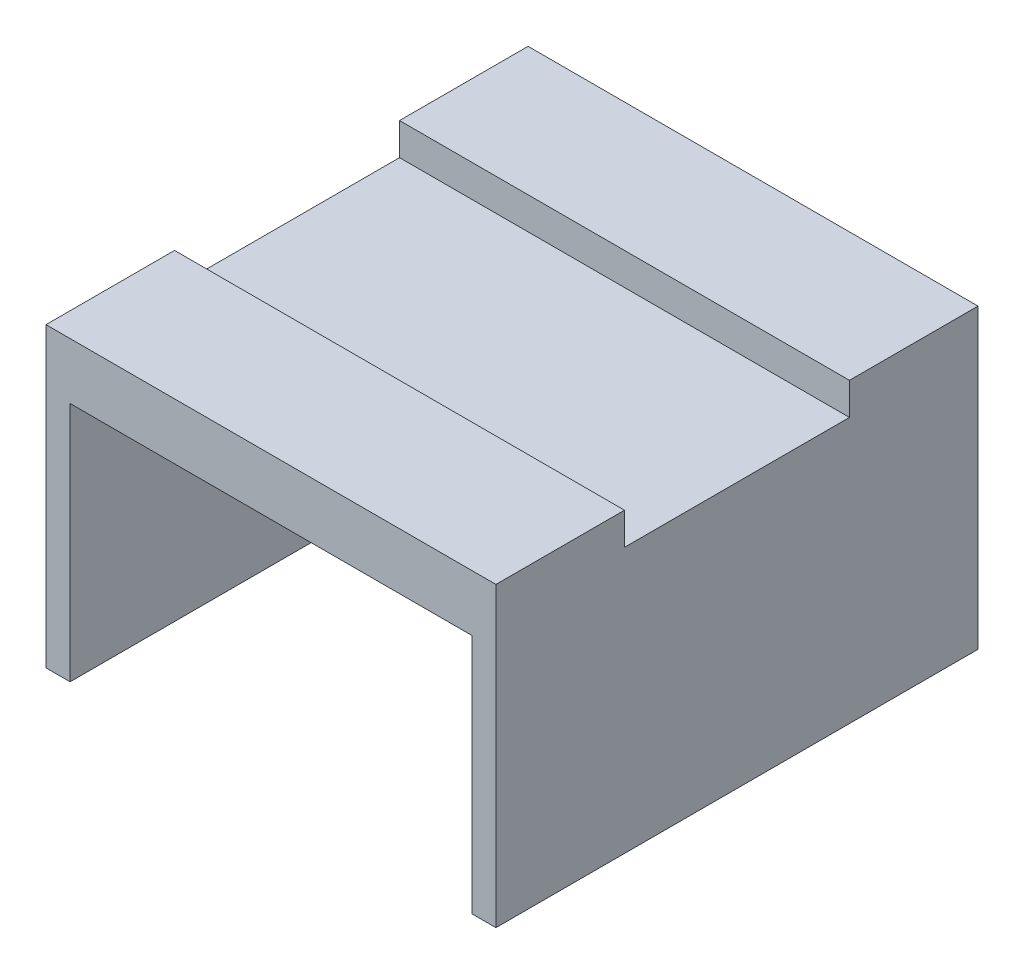
ISO-10303-21;
HEADER;
FILE_DESCRIPTION(('STEP AP214'),'2;1');
FILE_NAME('part.step','',(''),(''),'','','');
FILE_SCHEMA(('AUTOMOTIVE_DESIGN { 1 0 10303 214 1 1 1 1 }'));
ENDSEC;
DATA;
#1=APPLICATION_CONTEXT('core data for automotive mechanical design processes');
#2=APPLICATION_PROTOCOL_DEFINITION('international standard','automotive_design',2000,#1);
#3=PRODUCT_CONTEXT('',#1,'mechanical');
#4=PRODUCT('Part','Part','',(#3));
#5=PRODUCT_RELATED_PRODUCT_CATEGORY('part','',(#4));
#6=PRODUCT_DEFINITION_FORMATION('','',#4);
#7=PRODUCT_DEFINITION_CONTEXT('part definition',#1,'design');
#8=PRODUCT_DEFINITION('design','',#6,#7);
#9=PRODUCT_DEFINITION_SHAPE('','',#8);
#10=(LENGTH_UNIT() NAMED_UNIT(*) SI_UNIT(.MILLI.,.METRE.));
#11=(NAMED_UNIT(*) PLANE_ANGLE_UNIT() SI_UNIT($,.RADIAN.));
#12=(NAMED_UNIT(*) SI_UNIT($,.STERADIAN.) SOLID_ANGLE_UNIT());
#13=UNCERTAINTY_MEASURE_WITH_UNIT(LENGTH_MEASURE(1.E-05),#10,'distance_accuracy_value','');
#14=(GEOMETRIC_REPRESENTATION_CONTEXT(3) GLOBAL_UNCERTAINTY_ASSIGNED_CONTEXT((#13)) GLOBAL_UNIT_ASSIGNED_CONTEXT((#10,
#11,#12)) REPRESENTATION_CONTEXT('',''));
#15=CARTESIAN_POINT('',(0.,0.,0.));
#16=DIRECTION('',(0.,0.,1.));
#17=DIRECTION('',(1.,0.,0.));
#18=AXIS2_PLACEMENT_3D('',#15,#16,#17);
#19=CARTESIAN_POINT('',(0.,16.5,0.));
#20=DIRECTION('',(0.,1.,0.));
#21=DIRECTION('',(0.,0.,1.));
#22=AXIS2_PLACEMENT_3D('',#19,#20,#21);
#23=PLANE('',#22);
#24=DIRECTION('',(0.,0.,1.));
#25=VECTOR('',#24,1.);
#26=CARTESIAN_POINT('',(-12.9747634069401,16.5,-7.61041009463722));
#27=LINE('',#26,#25);
#28=CARTESIAN_POINT('',(-12.9747634069401,16.5,0.38958990536278));
#29=VERTEX_POINT('',#28);
#30=CARTESIAN_POINT('',(-12.9747634069401,16.5,14.3895899053628));
#31=VERTEX_POINT('',#30);
#32=EDGE_CURVE('E224',#29,#31,#27,.T.);
#33=ORIENTED_EDGE('',*,*,#32,.T.);
#34=DIRECTION('',(-1.,0.,0.));
#35=VECTOR('',#34,1.);
#36=CARTESIAN_POINT('',(-12.9747634069401,16.5,14.3895899053628));
#37=LINE('',#36,#35);
#38=CARTESIAN_POINT('',(15.0252365930599,16.5,14.3895899053628));
#39=VERTEX_POINT('',#38);
#40=EDGE_CURVE('E161',#39,#31,#37,.T.);
#41=ORIENTED_EDGE('',*,*,#40,.F.);
#42=DIRECTION('',(0.,0.,-1.));
#43=VECTOR('',#42,1.);
#44=CARTESIAN_POINT('',(15.0252365930599,16.5,-7.61041009463722));
#45=LINE('',#44,#43);
#46=CARTESIAN_POINT('',(15.0252365930599,16.5,0.38958990536278));
#47=VERTEX_POINT('',#46);
#48=EDGE_CURVE('E227',#39,#47,#45,.T.);
#49=ORIENTED_EDGE('',*,*,#48,.T.);
#50=DIRECTION('',(1.,0.,0.));
#51=VECTOR('',#50,1.);
#52=CARTESIAN_POINT('',(-12.9747634069401,16.5,0.38958990536278));
#53=LINE('',#52,#51);
#54=EDGE_CURVE('E65',#29,#47,#53,.T.);
#55=ORIENTED_EDGE('',*,*,#54,.F.);
#56=EDGE_LOOP('',(#33,#41,#49,#55));
#57=FACE_BOUND('',#56,.T.);
#58=ADVANCED_FACE('F39',(#57),#23,.T.);
#59=CARTESIAN_POINT('',(13.5252365930599,15.,-7.61041009463722));
#60=DIRECTION('',(0.,0.,-1.));
#61=DIRECTION('',(-1.,0.,0.));
#62=AXIS2_PLACEMENT_3D('',#59,#60,#61);
#63=PLANE('',#62);
#64=DIRECTION('',(1.,0.,0.));
#65=VECTOR('',#64,1.);
#66=CARTESIAN_POINT('',(13.5252365930599,0.,-7.61041009463722));
#67=LINE('',#66,#65);
#68=CARTESIAN_POINT('',(13.5252365930599,0.,-7.61041009463722));
#69=VERTEX_POINT('',#68);
#70=CARTESIAN_POINT('',(15.0252365930599,0.,-7.61041009463722));
#71=VERTEX_POINT('',#70);
#72=EDGE_CURVE('E144',#69,#71,#67,.T.);
#73=ORIENTED_EDGE('',*,*,#72,.F.);
#74=DIRECTION('',(0.,-1.,0.));
#75=VECTOR('',#74,1.);
#76=CARTESIAN_POINT('',(13.5252365930599,15.,-7.61041009463722));
#77=LINE('',#76,#75);
#78=CARTESIAN_POINT('',(13.5252365930599,15.,-7.61041009463722));
#79=VERTEX_POINT('',#78);
#80=EDGE_CURVE('E11',#79,#69,#77,.T.);
#81=ORIENTED_EDGE('',*,*,#80,.F.);
#82=DIRECTION('',(-1.,0.,0.));
#83=VECTOR('',#82,1.);
#84=CARTESIAN_POINT('',(-12.9747634069401,15.,-7.61041009463722));
#85=LINE('',#84,#83);
#86=CARTESIAN_POINT('',(-11.4747634069401,15.,-7.61041009463722));
#87=VERTEX_POINT('',#86);
#88=EDGE_CURVE('E228',#79,#87,#85,.T.);
#89=ORIENTED_EDGE('',*,*,#88,.T.);
#90=DIRECTION('',(0.,-1.,0.));
#91=VECTOR('',#90,1.);
#92=CARTESIAN_POINT('',(-11.4747634069401,15.,-7.61041009463722));
#93=LINE('',#92,#91);
#94=CARTESIAN_POINT('',(-11.4747634069401,0.,-7.61041009463722));
#95=VERTEX_POINT('',#94);
#96=EDGE_CURVE('E200',#87,#95,#93,.T.);
#97=ORIENTED_EDGE('',*,*,#96,.T.);
#98=DIRECTION('',(-1.,0.,0.));
#99=VECTOR('',#98,1.);
#100=CARTESIAN_POINT('',(-11.4747634069401,0.,-7.61041009463722));
#101=LINE('',#100,#99);
#102=CARTESIAN_POINT('',(-12.9747634069401,0.,-7.61041009463722));
#103=VERTEX_POINT('',#102);
#104=EDGE_CURVE('E207',#95,#103,#101,.T.);
#105=ORIENTED_EDGE('',*,*,#104,.T.);
#106=DIRECTION('',(0.,-1.,0.));
#107=VECTOR('',#106,1.);
#108=CARTESIAN_POINT('',(-12.9747634069401,16.5,-7.61041009463722));
#109=LINE('',#108,#107);
#110=CARTESIAN_POINT('',(-12.9747634069401,18.5,-7.61041009463722));
#111=VERTEX_POINT('',#110);
#112=EDGE_CURVE('E145',#111,#103,#109,.T.);
#113=ORIENTED_EDGE('',*,*,#112,.F.);
#114=DIRECTION('',(-1.,0.,0.));
#115=VECTOR('',#114,1.);
#116=CARTESIAN_POINT('',(-12.9747634069401,18.5,-7.61041009463722));
#117=LINE('',#116,#115);
#118=CARTESIAN_POINT('',(15.0252365930599,18.5,-7.61041009463722));
#119=VERTEX_POINT('',#118);
#120=EDGE_CURVE('E186',#119,#111,#117,.T.);
#121=ORIENTED_EDGE('',*,*,#120,.F.);
#122=DIRECTION('',(0.,-1.,0.));
#123=VECTOR('',#122,1.);
#124=CARTESIAN_POINT('',(15.0252365930599,15.,-7.61041009463722));
#125=LINE('',#124,#123);
#126=EDGE_CURVE('E43',#119,#71,#125,.T.);
#127=ORIENTED_EDGE('',*,*,#126,.T.);
#128=EDGE_LOOP('',(#73,#81,#89,#97,#105,#113,#121,#127));
#129=FACE_BOUND('',#128,.T.);
#130=ADVANCED_FACE('F41',(#129),#63,.T.);
#131=CARTESIAN_POINT('',(13.5252365930599,15.,-7.61041009463722));
#132=DIRECTION('',(1.,0.,0.));
#133=DIRECTION('',(0.,0.,-1.));
#134=AXIS2_PLACEMENT_3D('',#131,#132,#133);
#135=PLANE('',#134);
#136=DIRECTION('',(0.,0.,1.));
#137=VECTOR('',#136,1.);
#138=CARTESIAN_POINT('',(13.5252365930599,0.,-7.61041009463722));
#139=LINE('',#138,#137);
#140=CARTESIAN_POINT('',(13.5252365930599,0.,22.3895899053628));
#141=VERTEX_POINT('',#140);
#142=EDGE_CURVE('E242',#69,#141,#139,.T.);
#143=ORIENTED_EDGE('',*,*,#142,.T.);
#144=DIRECTION('',(0.,-1.,0.));
#145=VECTOR('',#144,1.);
#146=CARTESIAN_POINT('',(13.5252365930599,15.,22.3895899053628));
#147=LINE('',#146,#145);
#148=CARTESIAN_POINT('',(13.5252365930599,15.,22.3895899053628));
#149=VERTEX_POINT('',#148);
#150=EDGE_CURVE('E49',#149,#141,#147,.T.);
#151=ORIENTED_EDGE('',*,*,#150,.F.);
#152=DIRECTION('',(0.,0.,1.));
#153=VECTOR('',#152,1.);
#154=CARTESIAN_POINT('',(13.5252365930599,15.,-7.61041009463722));
#155=LINE('',#154,#153);
#156=EDGE_CURVE('E238',#79,#149,#155,.T.);
#157=ORIENTED_EDGE('',*,*,#156,.F.);
#158=ORIENTED_EDGE('',*,*,#80,.T.);
#159=EDGE_LOOP('',(#143,#151,#157,#158));
#160=FACE_BOUND('',#159,.T.);
#161=ADVANCED_FACE('F272',(#160),#135,.F.);
#162=CARTESIAN_POINT('',(13.5252365930599,15.,22.3895899053628));
#163=DIRECTION('',(0.,0.,-1.));
#164=DIRECTION('',(-1.,0.,0.));
#165=AXIS2_PLACEMENT_3D('',#162,#163,#164);
#166=PLANE('',#165);
#167=DIRECTION('',(1.,0.,0.));
#168=VECTOR('',#167,1.);
#169=CARTESIAN_POINT('',(13.5252365930599,0.,22.3895899053628));
#170=LINE('',#169,#168);
#171=CARTESIAN_POINT('',(15.0252365930599,0.,22.3895899053628));
#172=VERTEX_POINT('',#171);
#173=EDGE_CURVE('E250',#141,#172,#170,.T.);
#174=ORIENTED_EDGE('',*,*,#173,.T.);
#175=DIRECTION('',(0.,-1.,0.));
#176=VECTOR('',#175,1.);
#177=CARTESIAN_POINT('',(15.0252365930599,15.,22.3895899053628));
#178=LINE('',#177,#176);
#179=CARTESIAN_POINT('',(15.0252365930599,18.5,22.3895899053628));
#180=VERTEX_POINT('',#179);
#181=EDGE_CURVE('E151',#180,#172,#178,.T.);
#182=ORIENTED_EDGE('',*,*,#181,.F.);
#183=DIRECTION('',(1.,0.,0.));
#184=VECTOR('',#183,1.);
#185=CARTESIAN_POINT('',(-12.9747634069401,18.5,22.3895899053628));
#186=LINE('',#185,#184);
#187=CARTESIAN_POINT('',(-12.9747634069401,18.5,22.3895899053628));
#188=VERTEX_POINT('',#187);
#189=EDGE_CURVE('E148',#188,#180,#186,.T.);
#190=ORIENTED_EDGE('',*,*,#189,.F.);
#191=DIRECTION('',(0.,-1.,0.));
#192=VECTOR('',#191,1.);
#193=CARTESIAN_POINT('',(-12.9747634069401,16.5,22.3895899053628));
#194=LINE('',#193,#192);
#195=CARTESIAN_POINT('',(-12.9747634069401,0.,22.3895899053628));
#196=VERTEX_POINT('',#195);
#197=EDGE_CURVE('E132',#188,#196,#194,.T.);
#198=ORIENTED_EDGE('',*,*,#197,.T.);
#199=DIRECTION('',(-1.,0.,0.));
#200=VECTOR('',#199,1.);
#201=CARTESIAN_POINT('',(-11.4747634069401,0.,22.3895899053628));
#202=LINE('',#201,#200);
#203=CARTESIAN_POINT('',(-11.4747634069401,0.,22.3895899053628));
#204=VERTEX_POINT('',#203);
#205=EDGE_CURVE('E213',#204,#196,#202,.T.);
#206=ORIENTED_EDGE('',*,*,#205,.F.);
#207=DIRECTION('',(0.,-1.,0.));
#208=VECTOR('',#207,1.);
#209=CARTESIAN_POINT('',(-11.4747634069401,15.,22.3895899053628));
#210=LINE('',#209,#208);
#211=CARTESIAN_POINT('',(-11.4747634069401,15.,22.3895899053628));
#212=VERTEX_POINT('',#211);
#213=EDGE_CURVE('E201',#212,#204,#210,.T.);
#214=ORIENTED_EDGE('',*,*,#213,.F.);
#215=DIRECTION('',(1.,0.,0.));
#216=VECTOR('',#215,1.);
#217=CARTESIAN_POINT('',(-12.9747634069401,15.,22.3895899053628));
#218=LINE('',#217,#216);
#219=EDGE_CURVE('E220',#212,#149,#218,.T.);
#220=ORIENTED_EDGE('',*,*,#219,.T.);
#221=ORIENTED_EDGE('',*,*,#150,.T.);
#222=EDGE_LOOP('',(#174,#182,#190,#198,#206,#214,#220,#221));
#223=FACE_BOUND('',#222,.T.);
#224=ADVANCED_FACE('F150',(#223),#166,.F.);
#225=CARTESIAN_POINT('',(15.0252365930599,15.,-7.61041009463722));
#226=DIRECTION('',(1.,0.,0.));
#227=DIRECTION('',(0.,0.,-1.));
#228=AXIS2_PLACEMENT_3D('',#225,#226,#227);
#229=PLANE('',#228);
#230=DIRECTION('',(0.,0.,1.));
#231=VECTOR('',#230,1.);
#232=CARTESIAN_POINT('',(15.0252365930599,0.,-7.61041009463722));
#233=LINE('',#232,#231);
#234=EDGE_CURVE('E246',#71,#172,#233,.T.);
#235=ORIENTED_EDGE('',*,*,#234,.F.);
#236=ORIENTED_EDGE('',*,*,#126,.F.);
#237=DIRECTION('',(0.,0.,-1.));
#238=VECTOR('',#237,1.);
#239=CARTESIAN_POINT('',(15.0252365930599,18.5,-7.61041009463722));
#240=LINE('',#239,#238);
#241=CARTESIAN_POINT('',(15.0252365930599,18.5,0.38958990536278));
#242=VERTEX_POINT('',#241);
#243=EDGE_CURVE('E182',#242,#119,#240,.T.);
#244=ORIENTED_EDGE('',*,*,#243,.F.);
#245=DIRECTION('',(0.,-1.,0.));
#246=VECTOR('',#245,1.);
#247=CARTESIAN_POINT('',(15.0252365930599,18.5,0.38958990536278));
#248=LINE('',#247,#246);
#249=EDGE_CURVE('E190',#242,#47,#248,.T.);
#250=ORIENTED_EDGE('',*,*,#249,.T.);
#251=ORIENTED_EDGE('',*,*,#48,.F.);
#252=DIRECTION('',(0.,-1.,0.));
#253=VECTOR('',#252,1.);
#254=CARTESIAN_POINT('',(15.0252365930599,18.5,14.3895899053628));
#255=LINE('',#254,#253);
#256=CARTESIAN_POINT('',(15.0252365930599,18.5,14.3895899053628));
#257=VERTEX_POINT('',#256);
#258=EDGE_CURVE('E57',#257,#39,#255,.T.);
#259=ORIENTED_EDGE('',*,*,#258,.F.);
#260=DIRECTION('',(0.,0.,-1.));
#261=VECTOR('',#260,1.);
#262=CARTESIAN_POINT('',(15.0252365930599,18.5,22.3895899053628));
#263=LINE('',#262,#261);
#264=EDGE_CURVE('E155',#180,#257,#263,.T.);
#265=ORIENTED_EDGE('',*,*,#264,.F.);
#266=ORIENTED_EDGE('',*,*,#181,.T.);
#267=EDGE_LOOP('',(#235,#236,#244,#250,#251,#259,#265,#266));
#268=FACE_BOUND('',#267,.T.);
#269=ADVANCED_FACE('F265',(#268),#229,.T.);
#270=CARTESIAN_POINT('',(0.,0.,0.));
#271=DIRECTION('',(0.,-1.,0.));
#272=DIRECTION('',(0.,0.,-1.));
#273=AXIS2_PLACEMENT_3D('',#270,#271,#272);
#274=PLANE('',#273);
#275=ORIENTED_EDGE('',*,*,#72,.T.);
#276=ORIENTED_EDGE('',*,*,#234,.T.);
#277=ORIENTED_EDGE('',*,*,#173,.F.);
#278=ORIENTED_EDGE('',*,*,#142,.F.);
#279=EDGE_LOOP('',(#275,#276,#277,#278));
#280=FACE_BOUND('',#279,.T.);
#281=ADVANCED_FACE('F269',(#280),#274,.T.);
#282=CARTESIAN_POINT('',(0.,15.,0.));
#283=DIRECTION('',(0.,1.,0.));
#284=DIRECTION('',(0.,0.,1.));
#285=AXIS2_PLACEMENT_3D('',#282,#283,#284);
#286=PLANE('',#285);
#287=ORIENTED_EDGE('',*,*,#219,.F.);
#288=DIRECTION('',(0.,0.,1.));
#289=VECTOR('',#288,1.);
#290=CARTESIAN_POINT('',(-11.4747634069401,15.,-7.61041009463722));
#291=LINE('',#290,#289);
#292=EDGE_CURVE('E204',#87,#212,#291,.T.);
#293=ORIENTED_EDGE('',*,*,#292,.F.);
#294=ORIENTED_EDGE('',*,*,#88,.F.);
#295=ORIENTED_EDGE('',*,*,#156,.T.);
#296=EDGE_LOOP('',(#287,#293,#294,#295));
#297=FACE_BOUND('',#296,.T.);
#298=ADVANCED_FACE('F277',(#297),#286,.F.);
#299=CARTESIAN_POINT('',(-12.9747634069401,16.5,-7.61041009463722));
#300=DIRECTION('',(1.,0.,0.));
#301=DIRECTION('',(0.,0.,-1.));
#302=AXIS2_PLACEMENT_3D('',#299,#300,#301);
#303=PLANE('',#302);
#304=ORIENTED_EDGE('',*,*,#112,.T.);
#305=DIRECTION('',(0.,0.,1.));
#306=VECTOR('',#305,1.);
#307=CARTESIAN_POINT('',(-12.9747634069401,0.,-7.61041009463722));
#308=LINE('',#307,#306);
#309=EDGE_CURVE('E139',#103,#196,#308,.T.);
#310=ORIENTED_EDGE('',*,*,#309,.T.);
#311=ORIENTED_EDGE('',*,*,#197,.F.);
#312=DIRECTION('',(0.,0.,1.));
#313=VECTOR('',#312,1.);
#314=CARTESIAN_POINT('',(-12.9747634069401,18.5,22.3895899053628));
#315=LINE('',#314,#313);
#316=CARTESIAN_POINT('',(-12.9747634069401,18.5,14.3895899053628));
#317=VERTEX_POINT('',#316);
#318=EDGE_CURVE('E137',#317,#188,#315,.T.);
#319=ORIENTED_EDGE('',*,*,#318,.F.);
#320=DIRECTION('',(0.,-1.,0.));
#321=VECTOR('',#320,1.);
#322=CARTESIAN_POINT('',(-12.9747634069401,18.5,14.3895899053628));
#323=LINE('',#322,#321);
#324=EDGE_CURVE('E169',#317,#31,#323,.T.);
#325=ORIENTED_EDGE('',*,*,#324,.T.);
#326=ORIENTED_EDGE('',*,*,#32,.F.);
#327=DIRECTION('',(0.,-1.,0.));
#328=VECTOR('',#327,1.);
#329=CARTESIAN_POINT('',(-12.9747634069401,18.5,0.38958990536278));
#330=LINE('',#329,#328);
#331=CARTESIAN_POINT('',(-12.9747634069401,18.5,0.38958990536278));
#332=VERTEX_POINT('',#331);
#333=EDGE_CURVE('E196',#332,#29,#330,.T.);
#334=ORIENTED_EDGE('',*,*,#333,.F.);
#335=DIRECTION('',(0.,0.,1.));
#336=VECTOR('',#335,1.);
#337=CARTESIAN_POINT('',(-12.9747634069401,18.5,-7.61041009463722));
#338=LINE('',#337,#336);
#339=EDGE_CURVE('E175',#111,#332,#338,.T.);
#340=ORIENTED_EDGE('',*,*,#339,.F.);
#341=EDGE_LOOP('',(#304,#310,#311,#319,#325,#326,#334,#340));
#342=FACE_BOUND('',#341,.T.);
#343=ADVANCED_FACE('F134',(#342),#303,.F.);
#344=CARTESIAN_POINT('',(-11.4747634069401,15.,-7.61041009463722));
#345=DIRECTION('',(1.,0.,0.));
#346=DIRECTION('',(0.,0.,-1.));
#347=AXIS2_PLACEMENT_3D('',#344,#345,#346);
#348=PLANE('',#347);
#349=DIRECTION('',(0.,0.,1.));
#350=VECTOR('',#349,1.);
#351=CARTESIAN_POINT('',(-11.4747634069401,0.,-7.61041009463722));
#352=LINE('',#351,#350);
#353=EDGE_CURVE('E216',#95,#204,#352,.T.);
#354=ORIENTED_EDGE('',*,*,#353,.F.);
#355=ORIENTED_EDGE('',*,*,#96,.F.);
#356=ORIENTED_EDGE('',*,*,#292,.T.);
#357=ORIENTED_EDGE('',*,*,#213,.T.);
#358=EDGE_LOOP('',(#354,#355,#356,#357));
#359=FACE_BOUND('',#358,.T.);
#360=ADVANCED_FACE('F284',(#359),#348,.T.);
#361=CARTESIAN_POINT('',(0.,0.,0.));
#362=DIRECTION('',(0.,-1.,0.));
#363=DIRECTION('',(0.,0.,-1.));
#364=AXIS2_PLACEMENT_3D('',#361,#362,#363);
#365=PLANE('',#364);
#366=ORIENTED_EDGE('',*,*,#353,.T.);
#367=ORIENTED_EDGE('',*,*,#205,.T.);
#368=ORIENTED_EDGE('',*,*,#309,.F.);
#369=ORIENTED_EDGE('',*,*,#104,.F.);
#370=EDGE_LOOP('',(#366,#367,#368,#369));
#371=FACE_BOUND('',#370,.T.);
#372=ADVANCED_FACE('F283',(#371),#365,.T.);
#373=CARTESIAN_POINT('',(-12.9747634069401,18.5,0.38958990536278));
#374=DIRECTION('',(0.,0.,-1.));
#375=DIRECTION('',(-1.,0.,0.));
#376=AXIS2_PLACEMENT_3D('',#373,#374,#375);
#377=PLANE('',#376);
#378=ORIENTED_EDGE('',*,*,#54,.T.);
#379=ORIENTED_EDGE('',*,*,#249,.F.);
#380=DIRECTION('',(1.,0.,0.));
#381=VECTOR('',#380,1.);
#382=CARTESIAN_POINT('',(-12.9747634069401,18.5,0.38958990536278));
#383=LINE('',#382,#381);
#384=EDGE_CURVE('E179',#332,#242,#383,.T.);
#385=ORIENTED_EDGE('',*,*,#384,.F.);
#386=ORIENTED_EDGE('',*,*,#333,.T.);
#387=EDGE_LOOP('',(#378,#379,#385,#386));
#388=FACE_BOUND('',#387,.T.);
#389=ADVANCED_FACE('F291',(#388),#377,.F.);
#390=CARTESIAN_POINT('',(0.,18.5,0.));
#391=DIRECTION('',(0.,1.,0.));
#392=DIRECTION('',(0.,0.,1.));
#393=AXIS2_PLACEMENT_3D('',#390,#391,#392);
#394=PLANE('',#393);
#395=ORIENTED_EDGE('',*,*,#339,.T.);
#396=ORIENTED_EDGE('',*,*,#384,.T.);
#397=ORIENTED_EDGE('',*,*,#243,.T.);
#398=ORIENTED_EDGE('',*,*,#120,.T.);
#399=EDGE_LOOP('',(#395,#396,#397,#398));
#400=FACE_BOUND('',#399,.T.);
#401=ADVANCED_FACE('F336',(#400),#394,.T.);
#402=CARTESIAN_POINT('',(-12.9747634069401,18.5,14.3895899053628));
#403=DIRECTION('',(0.,0.,1.));
#404=DIRECTION('',(1.,0.,0.));
#405=AXIS2_PLACEMENT_3D('',#402,#403,#404);
#406=PLANE('',#405);
#407=ORIENTED_EDGE('',*,*,#40,.T.);
#408=ORIENTED_EDGE('',*,*,#324,.F.);
#409=DIRECTION('',(-1.,0.,0.));
#410=VECTOR('',#409,1.);
#411=CARTESIAN_POINT('',(-12.9747634069401,18.5,14.3895899053628));
#412=LINE('',#411,#410);
#413=EDGE_CURVE('E158',#257,#317,#412,.T.);
#414=ORIENTED_EDGE('',*,*,#413,.F.);
#415=ORIENTED_EDGE('',*,*,#258,.T.);
#416=EDGE_LOOP('',(#407,#408,#414,#415));
#417=FACE_BOUND('',#416,.T.);
#418=ADVANCED_FACE('F345',(#417),#406,.F.);
#419=CARTESIAN_POINT('',(0.,18.5,0.));
#420=DIRECTION('',(0.,-1.,0.));
#421=DIRECTION('',(0.,0.,-1.));
#422=AXIS2_PLACEMENT_3D('',#419,#420,#421);
#423=PLANE('',#422);
#424=ORIENTED_EDGE('',*,*,#318,.T.);
#425=ORIENTED_EDGE('',*,*,#189,.T.);
#426=ORIENTED_EDGE('',*,*,#264,.T.);
#427=ORIENTED_EDGE('',*,*,#413,.T.);
#428=EDGE_LOOP('',(#424,#425,#426,#427));
#429=FACE_BOUND('',#428,.T.);
#430=ADVANCED_FACE('F157',(#429),#423,.F.);
#431=CLOSED_SHELL('',(#58,#130,#161,#224,#269,#281,#298,#343,#360,#372,#389,#401,#418,#430));
#432=MANIFOLD_SOLID_BREP('B2',#431);
#433=ADVANCED_BREP_SHAPE_REPRESENTATION('',(#18,#432),#14);
#434=SHAPE_DEFINITION_REPRESENTATION(#9,#433);
ENDSEC;
END-ISO-10303-21;
